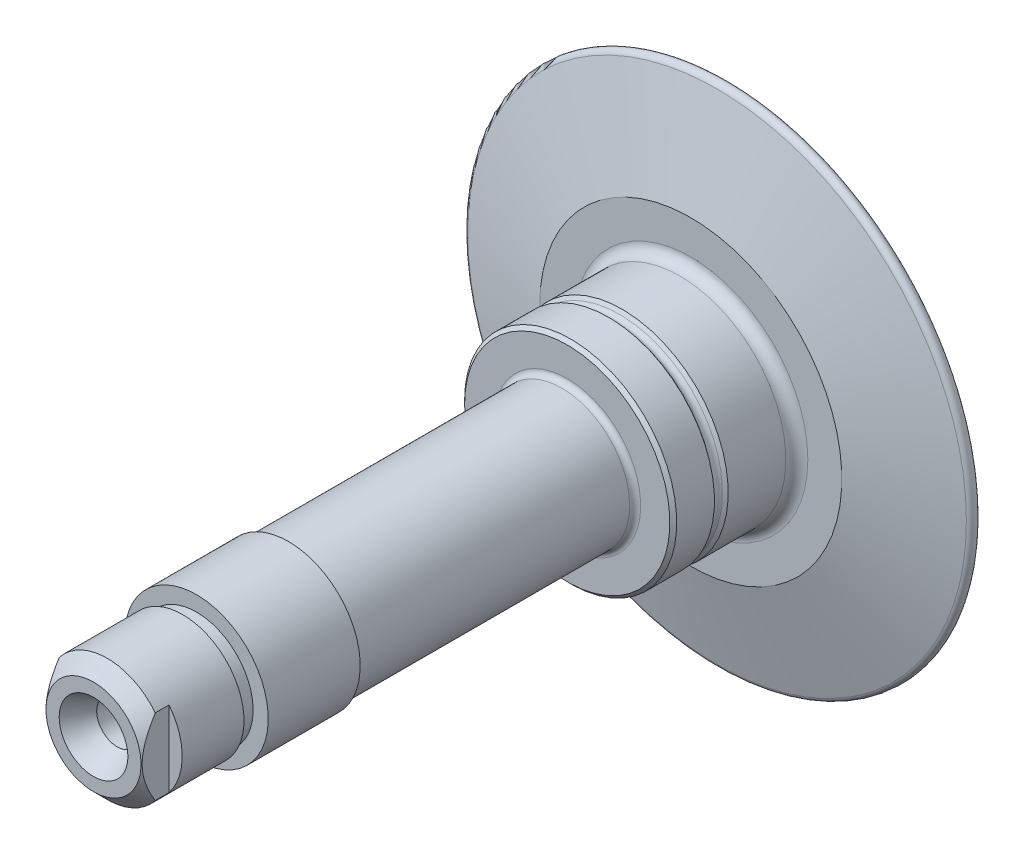
ISO-10303-21;
HEADER;
FILE_DESCRIPTION(('STEP AP214'),'2;1');
FILE_NAME('part.step','',(''),(''),'','','');
FILE_SCHEMA(('AUTOMOTIVE_DESIGN { 1 0 10303 214 1 1 1 1 }'));
ENDSEC;
DATA;
#1=APPLICATION_CONTEXT('core data for automotive mechanical design processes');
#2=APPLICATION_PROTOCOL_DEFINITION('international standard','automotive_design',2000,#1);
#3=PRODUCT_CONTEXT('',#1,'mechanical');
#4=PRODUCT('Part','Part','',(#3));
#5=PRODUCT_RELATED_PRODUCT_CATEGORY('part','',(#4));
#6=PRODUCT_DEFINITION_FORMATION('','',#4);
#7=PRODUCT_DEFINITION_CONTEXT('part definition',#1,'design');
#8=PRODUCT_DEFINITION('design','',#6,#7);
#9=PRODUCT_DEFINITION_SHAPE('','',#8);
#10=(LENGTH_UNIT() NAMED_UNIT(*) SI_UNIT(.MILLI.,.METRE.));
#11=(NAMED_UNIT(*) PLANE_ANGLE_UNIT() SI_UNIT($,.RADIAN.));
#12=(NAMED_UNIT(*) SI_UNIT($,.STERADIAN.) SOLID_ANGLE_UNIT());
#13=UNCERTAINTY_MEASURE_WITH_UNIT(LENGTH_MEASURE(1.E-05),#10,'distance_accuracy_value','');
#14=(GEOMETRIC_REPRESENTATION_CONTEXT(3) GLOBAL_UNCERTAINTY_ASSIGNED_CONTEXT((#13)) GLOBAL_UNIT_ASSIGNED_CONTEXT((#10,
#11,#12)) REPRESENTATION_CONTEXT('',''));
#15=CARTESIAN_POINT('',(0.,0.,0.));
#16=DIRECTION('',(0.,0.,1.));
#17=DIRECTION('',(1.,0.,0.));
#18=AXIS2_PLACEMENT_3D('',#15,#16,#17);
#19=CARTESIAN_POINT('',(0.,0.,60.));
#20=DIRECTION('',(0.,0.,-1.));
#21=DIRECTION('',(0.,1.,0.));
#22=AXIS2_PLACEMENT_3D('',#19,#20,#21);
#23=SPHERICAL_SURFACE('',#22,60.);
#24=CARTESIAN_POINT('',(0.,0.,2.81806583556102));
#25=DIRECTION('',(0.,0.,-1.));
#26=DIRECTION('',(-1.,0.,0.));
#27=AXIS2_PLACEMENT_3D('',#24,#25,#26);
#28=CIRCLE('',#27,18.1721326545281);
#29=CARTESIAN_POINT('',(-18.1721326545281,0.,2.81806583556102));
#30=VERTEX_POINT('',#29);
#31=EDGE_CURVE('E134',#30,#30,#28,.T.);
#32=ORIENTED_EDGE('',*,*,#31,.T.);
#33=EDGE_LOOP('',(#32));
#34=FACE_BOUND('',#33,.T.);
#35=ADVANCED_FACE('F43',(#34),#23,.T.);
#36=CARTESIAN_POINT('',(0.,0.,44.1692401209724));
#37=DIRECTION('',(0.,0.,1.));
#38=DIRECTION('',(1.,0.,0.));
#39=AXIS2_PLACEMENT_3D('',#36,#37,#38);
#40=CONICAL_SURFACE('',#39,1.49999999999999,1.02974425867665);
#41=CARTESIAN_POINT('',(0.,0.,43.2679491924311));
#42=VERTEX_POINT('',#41);
#43=VERTEX_LOOP('',#42);
#44=FACE_BOUND('',#43,.T.);
#45=CARTESIAN_POINT('',(0.,0.,44.1692401209724));
#46=DIRECTION('',(0.,0.,-1.));
#47=DIRECTION('',(-1.,0.,0.));
#48=AXIS2_PLACEMENT_3D('',#45,#46,#47);
#49=CIRCLE('',#48,1.49999999999999);
#50=CARTESIAN_POINT('',(-1.49999999999999,0.,44.1692401209724));
#51=VERTEX_POINT('',#50);
#52=EDGE_CURVE('E120',#51,#51,#49,.T.);
#53=ORIENTED_EDGE('',*,*,#52,.F.);
#54=EDGE_LOOP('',(#53));
#55=FACE_BOUND('',#54,.T.);
#56=ADVANCED_FACE('F174',(#44,#55),#40,.F.);
#57=CARTESIAN_POINT('',(0.,0.,0.));
#58=DIRECTION('',(0.,0.,-1.));
#59=DIRECTION('',(-1.,0.,0.));
#60=AXIS2_PLACEMENT_3D('',#57,#58,#59);
#61=CYLINDRICAL_SURFACE('',#60,1.49999999999999);
#62=ORIENTED_EDGE('',*,*,#52,.T.);
#63=EDGE_LOOP('',(#62));
#64=FACE_BOUND('',#63,.T.);
#65=CARTESIAN_POINT('',(0.,0.,47.2679491924311));
#66=DIRECTION('',(0.,0.,-1.));
#67=DIRECTION('',(-1.,0.,0.));
#68=AXIS2_PLACEMENT_3D('',#65,#66,#67);
#69=CIRCLE('',#68,1.49999999999999);
#70=CARTESIAN_POINT('',(-1.49999999999999,0.,47.2679491924311));
#71=VERTEX_POINT('',#70);
#72=EDGE_CURVE('E117',#71,#71,#69,.T.);
#73=ORIENTED_EDGE('',*,*,#72,.F.);
#74=EDGE_LOOP('',(#73));
#75=FACE_BOUND('',#74,.T.);
#76=ADVANCED_FACE('F179',(#64,#75),#61,.F.);
#77=CARTESIAN_POINT('',(0.,0.,49.));
#78=DIRECTION('',(0.,0.,1.));
#79=DIRECTION('',(1.,0.,0.));
#80=AXIS2_PLACEMENT_3D('',#77,#78,#79);
#81=CONICAL_SURFACE('',#80,2.49999999999999,0.523598775598293);
#82=ORIENTED_EDGE('',*,*,#72,.T.);
#83=EDGE_LOOP('',(#82));
#84=FACE_BOUND('',#83,.T.);
#85=CARTESIAN_POINT('',(0.,0.,49.));
#86=DIRECTION('',(0.,0.,-1.));
#87=DIRECTION('',(-1.,0.,0.));
#88=AXIS2_PLACEMENT_3D('',#85,#86,#87);
#89=CIRCLE('',#88,2.49999999999999);
#90=CARTESIAN_POINT('',(-2.49999999999999,0.,49.));
#91=VERTEX_POINT('',#90);
#92=EDGE_CURVE('E109',#91,#91,#89,.T.);
#93=ORIENTED_EDGE('',*,*,#92,.F.);
#94=EDGE_LOOP('',(#93));
#95=FACE_BOUND('',#94,.T.);
#96=ADVANCED_FACE('F487',(#84,#95),#81,.F.);
#97=CARTESIAN_POINT('',(0.,3.46000000000008,49.));
#98=DIRECTION('',(0.,0.,1.));
#99=DIRECTION('',(1.,0.,0.));
#100=AXIS2_PLACEMENT_3D('',#97,#98,#99);
#101=PLANE('',#100);
#102=ORIENTED_EDGE('',*,*,#92,.T.);
#103=EDGE_LOOP('',(#102));
#104=FACE_BOUND('',#103,.T.);
#105=CARTESIAN_POINT('',(0.,0.,49.));
#106=DIRECTION('',(0.,0.,-1.));
#107=DIRECTION('',(-1.,0.,0.));
#108=AXIS2_PLACEMENT_3D('',#105,#106,#107);
#109=CIRCLE('',#108,3.46000000000008);
#110=CARTESIAN_POINT('',(-3.46000000000008,0.,49.));
#111=VERTEX_POINT('',#110);
#112=EDGE_CURVE('E105',#111,#111,#109,.T.);
#113=ORIENTED_EDGE('',*,*,#112,.F.);
#114=EDGE_LOOP('',(#113));
#115=FACE_BOUND('',#114,.T.);
#116=ADVANCED_FACE('F155',(#104,#115),#101,.T.);
#117=CARTESIAN_POINT('',(0.,0.,48.));
#118=DIRECTION('',(0.,0.,-1.));
#119=DIRECTION('',(-1.,0.,0.));
#120=AXIS2_PLACEMENT_3D('',#117,#118,#119);
#121=CONICAL_SURFACE('',#120,4.45999999999999,0.785398163397405);
#122=CARTESIAN_POINT('',(-3.5,-7.11817970140146,44.5278828638598));
#123=CARTESIAN_POINT('',(-3.5,-6.95628515467729,44.6731443202349));
#124=CARTESIAN_POINT('',(-3.5,-6.79392843074706,44.817895155602));
#125=CARTESIAN_POINT('',(-3.5,-6.46804769240731,45.1061050222319));
#126=CARTESIAN_POINT('',(-3.5,-6.30452357688794,45.249563939105));
#127=CARTESIAN_POINT('',(-3.5,-5.97550848709255,45.5354020134382));
#128=CARTESIAN_POINT('',(-3.5,-5.81001258158247,45.6777755044755));
#129=CARTESIAN_POINT('',(-3.5,-5.47732060012213,45.960511866747));
#130=CARTESIAN_POINT('',(-3.5,-5.31012459164605,46.1008748172476));
#131=CARTESIAN_POINT('',(-3.5,-4.96401528403337,46.3869926431026));
#132=CARTESIAN_POINT('',(-3.5,-4.78497795819908,46.5325978964103));
#133=CARTESIAN_POINT('',(-3.5,-4.4239127397559,46.820048565151));
#134=CARTESIAN_POINT('',(-3.5,-4.24188500244293,46.9618941748336));
#135=CARTESIAN_POINT('',(-3.5,-3.874227504637,47.2403037071483));
#136=CARTESIAN_POINT('',(-3.5,-3.68860328374729,47.3768749120205));
#137=CARTESIAN_POINT('',(-3.5,-3.31237412103163,47.6429389977499));
#138=CARTESIAN_POINT('',(-3.5,-3.12177063352887,47.7724339119988));
#139=CARTESIAN_POINT('',(-3.5,-2.78391064511263,47.9892051380979));
#140=CARTESIAN_POINT('',(-3.5,-2.63812872404254,48.0787672096752));
#141=CARTESIAN_POINT('',(-3.5,-2.34208920727856,48.2503905386758));
#142=CARTESIAN_POINT('',(-3.5,-2.19182991712576,48.3324489072699));
#143=CARTESIAN_POINT('',(-3.5,-1.88742049450989,48.4856820043121));
#144=CARTESIAN_POINT('',(-3.5,-1.73331507780105,48.5569444696307));
#145=CARTESIAN_POINT('',(-3.5,-1.41948384948545,48.6858072626518));
#146=CARTESIAN_POINT('',(-3.5,-1.25976285884852,48.7434189957689));
#147=CARTESIAN_POINT('',(-3.5,-0.994724235595581,48.8227079130209));
#148=CARTESIAN_POINT('',(-3.5,-0.891029854615224,48.8498056017889));
#149=CARTESIAN_POINT('',(-3.5,-0.681800782154657,48.8956702880139));
#150=CARTESIAN_POINT('',(-3.5,-0.576266395068817,48.914438650063));
#151=CARTESIAN_POINT('',(-3.5,-0.364299855658049,48.9426536838431));
#152=CARTESIAN_POINT('',(-3.5,-0.257871879273694,48.9521312812515));
#153=CARTESIAN_POINT('',(-3.5,-0.0445885189874283,48.9613373163803));
#154=CARTESIAN_POINT('',(-3.5,0.0622668605898686,48.9610658524969));
#155=CARTESIAN_POINT('',(-3.5,0.275454924122703,48.9507920252998));
#156=CARTESIAN_POINT('',(-3.5,0.381787811808315,48.9407938176232));
#157=CARTESIAN_POINT('',(-3.5,0.593178062147929,48.9116352804396));
#158=CARTESIAN_POINT('',(-3.5,0.698235323269597,48.8924742264627));
#159=CARTESIAN_POINT('',(-3.5,0.906920387220526,48.8458459835073));
#160=CARTESIAN_POINT('',(-3.5,1.01054050130853,48.8183448413991));
#161=CARTESIAN_POINT('',(-3.5,1.21559128337704,48.7562033195798));
#162=CARTESIAN_POINT('',(-3.5,1.31702191103008,48.7215628084946));
#163=CARTESIAN_POINT('',(-3.5,1.5419060652411,48.6371569918555));
#164=CARTESIAN_POINT('',(-3.5,1.6647437491875,48.5857604893079));
#165=CARTESIAN_POINT('',(-3.5,1.90710174823051,48.475608570858));
#166=CARTESIAN_POINT('',(-3.5,2.02662036464063,48.4168494686116));
#167=CARTESIAN_POINT('',(-3.5,2.26283364668106,48.2934358174072));
#168=CARTESIAN_POINT('',(-3.5,2.37952264611784,48.2287705059261));
#169=CARTESIAN_POINT('',(-3.5,2.61020619640946,48.0948701530267));
#170=CARTESIAN_POINT('',(-3.5,2.72420116733442,48.0256358305082));
#171=CARTESIAN_POINT('',(-3.5,2.95148634966356,47.8825148974189));
#172=CARTESIAN_POINT('',(-3.5,3.0647436232809,47.8085762227774));
#173=CARTESIAN_POINT('',(-3.5,3.2892345085102,47.6576923394427));
#174=CARTESIAN_POINT('',(-3.5,3.40046805829291,47.5807470391156));
#175=CARTESIAN_POINT('',(-3.5,3.62107789113747,47.4245110324368));
#176=CARTESIAN_POINT('',(-3.5,3.73045616974801,47.3452231357746));
#177=CARTESIAN_POINT('',(-3.5,3.94773233663406,47.1846575804195));
#178=CARTESIAN_POINT('',(-3.5,4.05563028092794,47.1033799973456));
#179=CARTESIAN_POINT('',(-3.5,4.28998021082993,46.9240055503864));
#180=CARTESIAN_POINT('',(-3.5,4.41617699645939,46.8255756765214));
#181=CARTESIAN_POINT('',(-3.5,4.66708253968525,46.6268350475402));
#182=CARTESIAN_POINT('',(-3.5,4.79179125511928,46.5265242393364));
#183=CARTESIAN_POINT('',(-3.5,5.16407089570345,46.2232701040027));
#184=CARTESIAN_POINT('',(-3.5,5.40976766124745,46.0180264781648));
#185=CARTESIAN_POINT('',(-3.5,5.89763203848252,45.603203351602));
#186=CARTESIAN_POINT('',(-3.5,6.13979809954459,45.3936220381237));
#187=CARTESIAN_POINT('',(-3.5,6.62141661493497,44.9713581753736));
#188=CARTESIAN_POINT('',(-3.5,6.8608690052476,44.7586755532112));
#189=CARTESIAN_POINT('',(-3.5,7.33818597773268,44.3305581226463));
#190=CARTESIAN_POINT('',(-3.5,7.57604628122964,44.1151185533684));
#191=CARTESIAN_POINT('',(-3.5,8.05013816250165,43.6824505365551));
#192=CARTESIAN_POINT('',(-3.5,8.28636971815153,43.4652220648066));
#193=CARTESIAN_POINT('',(-3.5,8.99301415461073,42.8115791588059));
#194=CARTESIAN_POINT('',(-3.5,9.46150679772246,42.3730897955083));
#195=CARTESIAN_POINT('',(-3.5,10.3397584202392,41.5447746059041));
#196=CARTESIAN_POINT('',(-3.5,10.7498929229569,41.1553455760196));
#197=CARTESIAN_POINT('',(-3.5,11.5682885854657,40.3744593450757));
#198=CARTESIAN_POINT('',(-3.5,11.9765495931899,39.9830019846862));
#199=CARTESIAN_POINT('',(-3.5,12.7901987378166,39.2000241660108));
#200=CARTESIAN_POINT('',(-3.5,13.1955919271289,38.8085089524679));
#201=CARTESIAN_POINT('',(-3.5,14.0052466352267,38.0243833569202));
#202=CARTESIAN_POINT('',(-3.5,14.4095082535417,37.6317730777126));
#203=CARTESIAN_POINT('',(-3.5,14.8133767977005,37.2387604923028));
#204=B_SPLINE_CURVE_WITH_KNOTS('',3,(#122,#123,#124,#125,#126,#127,#128,#129,#130,#131,#132,
#133,#134,#135,#136,#137,#138,#139,#140,#141,#142,#143,#144,#145,#146,#147,#148,#149,#150,#151,
#152,#153,#154,#155,#156,#157,#158,#159,#160,#161,#162,#163,#164,#165,#166,#167,#168,#169,#170,
#171,#172,#173,#174,#175,#176,#177,#178,#179,#180,#181,#182,#183,#184,#185,#186,#187,#188,#189,
#190,#191,#192,#193,#194,#195,#196,#197,#198,#199,#200,#201,#202,#203),.UNSPECIFIED.,.F.,.F.,(4,
2,2,2,2,2,2,2,2,2,2,2,2,2,2,2,2,2,2,2,2,2,2,2,2,2,2,2,2,2,2,2,2,2,2,2,2,2,2,2,4),(0.,
0.65253430021402,1.30512582036193,1.96004191353779,2.61493211488628,3.30720793785708,
3.99944792298984,4.6906952379698,5.38174286517156,5.89486809102095,6.4081900390351,
6.91708621993759,7.42555569832354,7.74679870938486,8.06798907181619,8.38810663734153,
8.70822097195913,9.02819860152331,9.34820153463291,9.6695251223634,9.99085462341194,
10.3900075563802,10.7893611438972,11.1894575484486,11.5894911502139,11.9951995701978,
12.4009203647308,12.8061728574903,13.2114099722742,13.6915189365065,14.1716414718047,
15.1319914325598,16.0927511757587,17.0535335363618,18.0162919915634,18.9790634993696,
20.904080998024,22.6007734036482,24.2976011723876,25.9883532448592,27.6789516115328),.UNSPECIFIED.);
#205=CARTESIAN_POINT('',(-3.5,-2.76434440690735,48.));
#206=VERTEX_POINT('',#205);
#207=CARTESIAN_POINT('',(-3.5,2.76434440690735,48.));
#208=VERTEX_POINT('',#207);
#209=EDGE_CURVE('E93',#206,#208,#204,.T.);
#210=ORIENTED_EDGE('',*,*,#209,.F.);
#211=CARTESIAN_POINT('',(0.,0.,48.));
#212=DIRECTION('',(0.,0.,-1.));
#213=DIRECTION('',(-1.,0.,0.));
#214=AXIS2_PLACEMENT_3D('',#211,#212,#213);
#215=CIRCLE('',#214,4.45999999999999);
#216=CARTESIAN_POINT('',(3.5,-2.76434440690735,48.));
#217=VERTEX_POINT('',#216);
#218=EDGE_CURVE('E100',#217,#206,#215,.T.);
#219=ORIENTED_EDGE('',*,*,#218,.F.);
#220=CARTESIAN_POINT('',(3.5,-7.11817970140146,44.5278828638598));
#221=CARTESIAN_POINT('',(3.5,-6.95628515467729,44.6731443202349));
#222=CARTESIAN_POINT('',(3.5,-6.79392843074706,44.817895155602));
#223=CARTESIAN_POINT('',(3.5,-6.46804769240731,45.1061050222319));
#224=CARTESIAN_POINT('',(3.5,-6.30452357688794,45.249563939105));
#225=CARTESIAN_POINT('',(3.5,-5.97550848709255,45.5354020134382));
#226=CARTESIAN_POINT('',(3.5,-5.81001258158247,45.6777755044755));
#227=CARTESIAN_POINT('',(3.5,-5.47732060012213,45.960511866747));
#228=CARTESIAN_POINT('',(3.5,-5.31012459164605,46.1008748172476));
#229=CARTESIAN_POINT('',(3.5,-4.96401528403337,46.3869926431026));
#230=CARTESIAN_POINT('',(3.5,-4.78497795819908,46.5325978964103));
#231=CARTESIAN_POINT('',(3.5,-4.4239127397559,46.820048565151));
#232=CARTESIAN_POINT('',(3.5,-4.24188500244293,46.9618941748336));
#233=CARTESIAN_POINT('',(3.5,-3.874227504637,47.2403037071483));
#234=CARTESIAN_POINT('',(3.5,-3.68860328374729,47.3768749120205));
#235=CARTESIAN_POINT('',(3.5,-3.31237412103163,47.6429389977499));
#236=CARTESIAN_POINT('',(3.5,-3.12177063352887,47.7724339119988));
#237=CARTESIAN_POINT('',(3.5,-2.78391064511263,47.9892051380979));
#238=CARTESIAN_POINT('',(3.5,-2.63812872404254,48.0787672096752));
#239=CARTESIAN_POINT('',(3.5,-2.34208920727856,48.2503905386758));
#240=CARTESIAN_POINT('',(3.5,-2.19182991712576,48.3324489072699));
#241=CARTESIAN_POINT('',(3.5,-1.88742049450989,48.4856820043121));
#242=CARTESIAN_POINT('',(3.5,-1.73331507780105,48.5569444696307));
#243=CARTESIAN_POINT('',(3.5,-1.41948384948545,48.6858072626518));
#244=CARTESIAN_POINT('',(3.5,-1.25976285884852,48.7434189957689));
#245=CARTESIAN_POINT('',(3.5,-0.994724235595581,48.8227079130209));
#246=CARTESIAN_POINT('',(3.5,-0.891029854615224,48.8498056017889));
#247=CARTESIAN_POINT('',(3.5,-0.681800782154657,48.8956702880139));
#248=CARTESIAN_POINT('',(3.5,-0.576266395068817,48.914438650063));
#249=CARTESIAN_POINT('',(3.5,-0.364299855658049,48.9426536838431));
#250=CARTESIAN_POINT('',(3.5,-0.257871879273694,48.9521312812515));
#251=CARTESIAN_POINT('',(3.5,-0.0445885189874283,48.9613373163803));
#252=CARTESIAN_POINT('',(3.5,0.0622668605898686,48.9610658524969));
#253=CARTESIAN_POINT('',(3.5,0.275454924122703,48.9507920252998));
#254=CARTESIAN_POINT('',(3.5,0.381787811808315,48.9407938176232));
#255=CARTESIAN_POINT('',(3.5,0.593178062147929,48.9116352804396));
#256=CARTESIAN_POINT('',(3.5,0.698235323269597,48.8924742264627));
#257=CARTESIAN_POINT('',(3.5,0.906920387220526,48.8458459835073));
#258=CARTESIAN_POINT('',(3.5,1.01054050130853,48.8183448413991));
#259=CARTESIAN_POINT('',(3.5,1.21559128337704,48.7562033195798));
#260=CARTESIAN_POINT('',(3.5,1.31702191103008,48.7215628084946));
#261=CARTESIAN_POINT('',(3.5,1.5419060652411,48.6371569918555));
#262=CARTESIAN_POINT('',(3.5,1.6647437491875,48.5857604893079));
#263=CARTESIAN_POINT('',(3.5,1.90710174823051,48.475608570858));
#264=CARTESIAN_POINT('',(3.5,2.02662036464063,48.4168494686116));
#265=CARTESIAN_POINT('',(3.5,2.26283364668106,48.2934358174072));
#266=CARTESIAN_POINT('',(3.5,2.37952264611784,48.2287705059261));
#267=CARTESIAN_POINT('',(3.5,2.61020619640946,48.0948701530267));
#268=CARTESIAN_POINT('',(3.5,2.72420116733442,48.0256358305082));
#269=CARTESIAN_POINT('',(3.5,2.95148634966356,47.8825148974189));
#270=CARTESIAN_POINT('',(3.5,3.0647436232809,47.8085762227774));
#271=CARTESIAN_POINT('',(3.5,3.2892345085102,47.6576923394427));
#272=CARTESIAN_POINT('',(3.5,3.40046805829291,47.5807470391156));
#273=CARTESIAN_POINT('',(3.5,3.62107789113747,47.4245110324368));
#274=CARTESIAN_POINT('',(3.5,3.73045616974801,47.3452231357746));
#275=CARTESIAN_POINT('',(3.5,3.94773233663406,47.1846575804195));
#276=CARTESIAN_POINT('',(3.5,4.05563028092794,47.1033799973456));
#277=CARTESIAN_POINT('',(3.5,4.28998021082993,46.9240055503864));
#278=CARTESIAN_POINT('',(3.5,4.41617699645939,46.8255756765214));
#279=CARTESIAN_POINT('',(3.5,4.66708253968525,46.6268350475402));
#280=CARTESIAN_POINT('',(3.5,4.79179125511928,46.5265242393364));
#281=CARTESIAN_POINT('',(3.5,5.16407089570345,46.2232701040027));
#282=CARTESIAN_POINT('',(3.5,5.40976766124745,46.0180264781648));
#283=CARTESIAN_POINT('',(3.5,5.89763203848252,45.603203351602));
#284=CARTESIAN_POINT('',(3.5,6.13979809954459,45.3936220381237));
#285=CARTESIAN_POINT('',(3.5,6.62141661493497,44.9713581753736));
#286=CARTESIAN_POINT('',(3.5,6.8608690052476,44.7586755532112));
#287=CARTESIAN_POINT('',(3.5,7.33818597773268,44.3305581226463));
#288=CARTESIAN_POINT('',(3.5,7.57604628122964,44.1151185533684));
#289=CARTESIAN_POINT('',(3.5,8.05013816250165,43.6824505365551));
#290=CARTESIAN_POINT('',(3.5,8.28636971815153,43.4652220648066));
#291=CARTESIAN_POINT('',(3.5,8.99301415461073,42.8115791588059));
#292=CARTESIAN_POINT('',(3.5,9.46150679772246,42.3730897955083));
#293=CARTESIAN_POINT('',(3.5,10.3397584202392,41.5447746059041));
#294=CARTESIAN_POINT('',(3.5,10.7498929229569,41.1553455760196));
#295=CARTESIAN_POINT('',(3.5,11.5682885854657,40.3744593450757));
#296=CARTESIAN_POINT('',(3.5,11.9765495931899,39.9830019846862));
#297=CARTESIAN_POINT('',(3.5,12.7901987378166,39.2000241660108));
#298=CARTESIAN_POINT('',(3.5,13.1955919271289,38.8085089524679));
#299=CARTESIAN_POINT('',(3.5,14.0052466352267,38.0243833569202));
#300=CARTESIAN_POINT('',(3.5,14.4095082535417,37.6317730777126));
#301=CARTESIAN_POINT('',(3.5,14.8133767977005,37.2387604923028));
#302=B_SPLINE_CURVE_WITH_KNOTS('',3,(#220,#221,#222,#223,#224,#225,#226,#227,#228,#229,#230,
#231,#232,#233,#234,#235,#236,#237,#238,#239,#240,#241,#242,#243,#244,#245,#246,#247,#248,#249,
#250,#251,#252,#253,#254,#255,#256,#257,#258,#259,#260,#261,#262,#263,#264,#265,#266,#267,#268,
#269,#270,#271,#272,#273,#274,#275,#276,#277,#278,#279,#280,#281,#282,#283,#284,#285,#286,#287,
#288,#289,#290,#291,#292,#293,#294,#295,#296,#297,#298,#299,#300,#301),.UNSPECIFIED.,.F.,.F.,(4,
2,2,2,2,2,2,2,2,2,2,2,2,2,2,2,2,2,2,2,2,2,2,2,2,2,2,2,2,2,2,2,2,2,2,2,2,2,2,2,4),(0.,
0.65253430021402,1.30512582036193,1.96004191353779,2.61493211488628,3.30720793785708,
3.99944792298984,4.6906952379698,5.38174286517156,5.89486809102095,6.4081900390351,
6.91708621993759,7.42555569832354,7.74679870938486,8.06798907181619,8.38810663734153,
8.70822097195913,9.02819860152331,9.34820153463291,9.6695251223634,9.99085462341194,
10.3900075563802,10.7893611438972,11.1894575484486,11.5894911502139,11.9951995701978,
12.4009203647308,12.8061728574903,13.2114099722742,13.6915189365065,14.1716414718047,
15.1319914325598,16.0927511757587,17.0535335363618,18.0162919915634,18.9790634993696,
20.904080998024,22.6007734036482,24.2976011723876,25.9883532448592,27.6789516115328),.UNSPECIFIED.);
#303=CARTESIAN_POINT('',(3.5,2.76434440690735,48.));
#304=VERTEX_POINT('',#303);
#305=EDGE_CURVE('E130',#304,#217,#302,.F.);
#306=ORIENTED_EDGE('',*,*,#305,.F.);
#307=EDGE_CURVE('E106',#208,#304,#215,.T.);
#308=ORIENTED_EDGE('',*,*,#307,.F.);
#309=EDGE_LOOP('',(#210,#219,#306,#308));
#310=FACE_BOUND('',#309,.T.);
#311=ORIENTED_EDGE('',*,*,#112,.T.);
#312=EDGE_LOOP('',(#311));
#313=FACE_BOUND('',#312,.T.);
#314=ADVANCED_FACE('F132',(#310,#313),#121,.T.);
#315=CARTESIAN_POINT('',(0.,0.,0.));
#316=DIRECTION('',(0.,0.,-1.));
#317=DIRECTION('',(-1.,0.,0.));
#318=AXIS2_PLACEMENT_3D('',#315,#316,#317);
#319=CYLINDRICAL_SURFACE('',#318,4.45999999999999);
#320=DIRECTION('',(0.,0.,-1.));
#321=VECTOR('',#320,1.);
#322=CARTESIAN_POINT('',(-3.5,-2.76434440690735,0.));
#323=LINE('',#322,#321);
#324=CARTESIAN_POINT('',(-3.5,-2.76434440690735,47.));
#325=VERTEX_POINT('',#324);
#326=EDGE_CURVE('E11',#325,#206,#323,.F.);
#327=ORIENTED_EDGE('',*,*,#326,.F.);
#328=CARTESIAN_POINT('',(0.,0.,47.));
#329=DIRECTION('',(0.,0.,-1.));
#330=DIRECTION('',(-1.,0.,0.));
#331=AXIS2_PLACEMENT_3D('',#328,#329,#330);
#332=CIRCLE('',#331,4.45999999999999);
#333=CARTESIAN_POINT('',(-3.5,2.76434440690735,47.));
#334=VERTEX_POINT('',#333);
#335=EDGE_CURVE('E83',#334,#325,#332,.F.);
#336=ORIENTED_EDGE('',*,*,#335,.F.);
#337=DIRECTION('',(0.,0.,-1.));
#338=VECTOR('',#337,1.);
#339=CARTESIAN_POINT('',(-3.5,2.76434440690735,0.));
#340=LINE('',#339,#338);
#341=EDGE_CURVE('E50',#208,#334,#340,.T.);
#342=ORIENTED_EDGE('',*,*,#341,.F.);
#343=ORIENTED_EDGE('',*,*,#307,.T.);
#344=DIRECTION('',(0.,0.,-1.));
#345=VECTOR('',#344,1.);
#346=CARTESIAN_POINT('',(3.5,2.76434440690735,0.));
#347=LINE('',#346,#345);
#348=CARTESIAN_POINT('',(3.5,2.76434440690735,47.));
#349=VERTEX_POINT('',#348);
#350=EDGE_CURVE('E88',#349,#304,#347,.F.);
#351=ORIENTED_EDGE('',*,*,#350,.F.);
#352=CARTESIAN_POINT('',(0.,0.,47.));
#353=DIRECTION('',(0.,0.,1.));
#354=DIRECTION('',(1.,0.,0.));
#355=AXIS2_PLACEMENT_3D('',#352,#353,#354);
#356=CIRCLE('',#355,4.45999999999999);
#357=CARTESIAN_POINT('',(3.5,-2.76434440690735,47.));
#358=VERTEX_POINT('',#357);
#359=EDGE_CURVE('E123',#349,#358,#356,.F.);
#360=ORIENTED_EDGE('',*,*,#359,.T.);
#361=DIRECTION('',(0.,0.,-1.));
#362=VECTOR('',#361,1.);
#363=CARTESIAN_POINT('',(3.5,-2.76434440690735,0.));
#364=LINE('',#363,#362);
#365=EDGE_CURVE('E102',#217,#358,#364,.T.);
#366=ORIENTED_EDGE('',*,*,#365,.F.);
#367=ORIENTED_EDGE('',*,*,#218,.T.);
#368=EDGE_LOOP('',(#327,#336,#342,#343,#351,#360,#366,#367));
#369=FACE_BOUND('',#368,.T.);
#370=CARTESIAN_POINT('',(0.,0.,42.5));
#371=DIRECTION('',(0.,0.,-1.));
#372=DIRECTION('',(-1.,0.,0.));
#373=AXIS2_PLACEMENT_3D('',#370,#371,#372);
#374=CIRCLE('',#373,4.45999999999999);
#375=CARTESIAN_POINT('',(-4.45999999999999,0.,42.5));
#376=VERTEX_POINT('',#375);
#377=EDGE_CURVE('E111',#376,#376,#374,.T.);
#378=ORIENTED_EDGE('',*,*,#377,.F.);
#379=EDGE_LOOP('',(#378));
#380=FACE_BOUND('',#379,.T.);
#381=ADVANCED_FACE('F96',(#369,#380),#319,.T.);
#382=CARTESIAN_POINT('',(0.,4.45999999999999,42.5));
#383=DIRECTION('',(0.,0.,-1.));
#384=DIRECTION('',(-1.,0.,0.));
#385=AXIS2_PLACEMENT_3D('',#382,#383,#384);
#386=PLANE('',#385);
#387=ORIENTED_EDGE('',*,*,#377,.T.);
#388=EDGE_LOOP('',(#387));
#389=FACE_BOUND('',#388,.T.);
#390=CARTESIAN_POINT('',(0.,0.,42.5));
#391=DIRECTION('',(0.,0.,-1.));
#392=DIRECTION('',(-1.,0.,0.));
#393=AXIS2_PLACEMENT_3D('',#390,#391,#392);
#394=CIRCLE('',#393,4.12499999999999);
#395=CARTESIAN_POINT('',(-4.12499999999999,0.,42.5));
#396=VERTEX_POINT('',#395);
#397=EDGE_CURVE('E264',#396,#396,#394,.T.);
#398=ORIENTED_EDGE('',*,*,#397,.F.);
#399=EDGE_LOOP('',(#398));
#400=FACE_BOUND('',#399,.T.);
#401=ADVANCED_FACE('F251',(#389,#400),#386,.T.);
#402=CARTESIAN_POINT('',(0.,0.,0.));
#403=DIRECTION('',(0.,0.,-1.));
#404=DIRECTION('',(-1.,0.,0.));
#405=AXIS2_PLACEMENT_3D('',#402,#403,#404);
#406=CYLINDRICAL_SURFACE('',#405,4.12499999999999);
#407=ORIENTED_EDGE('',*,*,#397,.T.);
#408=EDGE_LOOP('',(#407));
#409=FACE_BOUND('',#408,.T.);
#410=CARTESIAN_POINT('',(0.,0.,41.5));
#411=DIRECTION('',(0.,0.,-1.));
#412=DIRECTION('',(-1.,0.,0.));
#413=AXIS2_PLACEMENT_3D('',#410,#411,#412);
#414=CIRCLE('',#413,4.12499999999999);
#415=CARTESIAN_POINT('',(-4.12499999999999,0.,41.5));
#416=VERTEX_POINT('',#415);
#417=EDGE_CURVE('E265',#416,#416,#414,.T.);
#418=ORIENTED_EDGE('',*,*,#417,.F.);
#419=EDGE_LOOP('',(#418));
#420=FACE_BOUND('',#419,.T.);
#421=ADVANCED_FACE('F248',(#409,#420),#406,.T.);
#422=CARTESIAN_POINT('',(0.,5.22499999999999,41.5));
#423=DIRECTION('',(0.,0.,1.));
#424=DIRECTION('',(1.,0.,0.));
#425=AXIS2_PLACEMENT_3D('',#422,#423,#424);
#426=PLANE('',#425);
#427=ORIENTED_EDGE('',*,*,#417,.T.);
#428=EDGE_LOOP('',(#427));
#429=FACE_BOUND('',#428,.T.);
#430=CARTESIAN_POINT('',(0.,0.,41.5));
#431=DIRECTION('',(0.,0.,-1.));
#432=DIRECTION('',(-1.,0.,0.));
#433=AXIS2_PLACEMENT_3D('',#430,#431,#432);
#434=CIRCLE('',#433,5.22499999999999);
#435=CARTESIAN_POINT('',(-5.22499999999999,0.,41.5));
#436=VERTEX_POINT('',#435);
#437=EDGE_CURVE('E267',#436,#436,#434,.T.);
#438=ORIENTED_EDGE('',*,*,#437,.F.);
#439=EDGE_LOOP('',(#438));
#440=FACE_BOUND('',#439,.T.);
#441=ADVANCED_FACE('F244',(#429,#440),#426,.T.);
#442=CARTESIAN_POINT('',(0.,0.,0.));
#443=DIRECTION('',(0.,0.,-1.));
#444=DIRECTION('',(-1.,0.,0.));
#445=AXIS2_PLACEMENT_3D('',#442,#443,#444);
#446=CYLINDRICAL_SURFACE('',#445,5.225);
#447=ORIENTED_EDGE('',*,*,#437,.T.);
#448=EDGE_LOOP('',(#447));
#449=FACE_BOUND('',#448,.T.);
#450=CARTESIAN_POINT('',(0.,0.,34.8));
#451=DIRECTION('',(0.,0.,-1.));
#452=DIRECTION('',(-1.,0.,0.));
#453=AXIS2_PLACEMENT_3D('',#450,#451,#452);
#454=CIRCLE('',#453,5.225);
#455=CARTESIAN_POINT('',(-5.225,0.,34.8));
#456=VERTEX_POINT('',#455);
#457=EDGE_CURVE('E272',#456,#456,#454,.T.);
#458=ORIENTED_EDGE('',*,*,#457,.F.);
#459=EDGE_LOOP('',(#458));
#460=FACE_BOUND('',#459,.T.);
#461=ADVANCED_FACE('F240',(#449,#460),#446,.T.);
#462=CARTESIAN_POINT('',(0.,4.95,34.8));
#463=DIRECTION('',(0.,0.,-1.));
#464=DIRECTION('',(-1.,0.,0.));
#465=AXIS2_PLACEMENT_3D('',#462,#463,#464);
#466=PLANE('',#465);
#467=ORIENTED_EDGE('',*,*,#457,.T.);
#468=EDGE_LOOP('',(#467));
#469=FACE_BOUND('',#468,.T.);
#470=CARTESIAN_POINT('',(0.,0.,34.8));
#471=DIRECTION('',(0.,0.,-1.));
#472=DIRECTION('',(-1.,0.,0.));
#473=AXIS2_PLACEMENT_3D('',#470,#471,#472);
#474=CIRCLE('',#473,4.95);
#475=CARTESIAN_POINT('',(-4.95,0.,34.8));
#476=VERTEX_POINT('',#475);
#477=EDGE_CURVE('E275',#476,#476,#474,.T.);
#478=ORIENTED_EDGE('',*,*,#477,.F.);
#479=EDGE_LOOP('',(#478));
#480=FACE_BOUND('',#479,.T.);
#481=ADVANCED_FACE('F236',(#469,#480),#466,.T.);
#482=CARTESIAN_POINT('',(0.,0.,0.));
#483=DIRECTION('',(0.,0.,-1.));
#484=DIRECTION('',(-1.,0.,0.));
#485=AXIS2_PLACEMENT_3D('',#482,#483,#484);
#486=CYLINDRICAL_SURFACE('',#485,4.95);
#487=ORIENTED_EDGE('',*,*,#477,.T.);
#488=EDGE_LOOP('',(#487));
#489=FACE_BOUND('',#488,.T.);
#490=CARTESIAN_POINT('',(0.,0.,14.9));
#491=DIRECTION('',(0.,0.,-1.));
#492=DIRECTION('',(-1.,0.,0.));
#493=AXIS2_PLACEMENT_3D('',#490,#491,#492);
#494=CIRCLE('',#493,4.95);
#495=CARTESIAN_POINT('',(-4.95,0.,14.9));
#496=VERTEX_POINT('',#495);
#497=EDGE_CURVE('E278',#496,#496,#494,.T.);
#498=ORIENTED_EDGE('',*,*,#497,.F.);
#499=EDGE_LOOP('',(#498));
#500=FACE_BOUND('',#499,.T.);
#501=ADVANCED_FACE('F232',(#489,#500),#486,.T.);
#502=CARTESIAN_POINT('',(0.,0.,14.9));
#503=DIRECTION('',(0.,0.,-1.));
#504=DIRECTION('',(-1.,0.,0.));
#505=AXIS2_PLACEMENT_3D('',#502,#503,#504);
#506=TOROIDAL_SURFACE('',#505,5.35,0.4);
#507=ORIENTED_EDGE('',*,*,#497,.T.);
#508=EDGE_LOOP('',(#507));
#509=FACE_BOUND('',#508,.T.);
#510=CARTESIAN_POINT('',(0.,0.,14.5));
#511=DIRECTION('',(0.,0.,-1.));
#512=DIRECTION('',(-1.,0.,0.));
#513=AXIS2_PLACEMENT_3D('',#510,#511,#512);
#514=CIRCLE('',#513,5.35);
#515=CARTESIAN_POINT('',(-5.35,0.,14.5));
#516=VERTEX_POINT('',#515);
#517=EDGE_CURVE('E281',#516,#516,#514,.T.);
#518=ORIENTED_EDGE('',*,*,#517,.F.);
#519=EDGE_LOOP('',(#518));
#520=FACE_BOUND('',#519,.T.);
#521=ADVANCED_FACE('F228',(#509,#520),#506,.F.);
#522=CARTESIAN_POINT('',(0.,7.47500000000002,14.5));
#523=DIRECTION('',(0.,0.,1.));
#524=DIRECTION('',(1.,0.,0.));
#525=AXIS2_PLACEMENT_3D('',#522,#523,#524);
#526=PLANE('',#525);
#527=ORIENTED_EDGE('',*,*,#517,.T.);
#528=EDGE_LOOP('',(#527));
#529=FACE_BOUND('',#528,.T.);
#530=CARTESIAN_POINT('',(0.,0.,14.5));
#531=DIRECTION('',(0.,0.,-1.));
#532=DIRECTION('',(-1.,0.,0.));
#533=AXIS2_PLACEMENT_3D('',#530,#531,#532);
#534=CIRCLE('',#533,7.47500000000002);
#535=CARTESIAN_POINT('',(-7.47500000000002,0.,14.5));
#536=VERTEX_POINT('',#535);
#537=EDGE_CURVE('E284',#536,#536,#534,.T.);
#538=ORIENTED_EDGE('',*,*,#537,.F.);
#539=EDGE_LOOP('',(#538));
#540=FACE_BOUND('',#539,.T.);
#541=ADVANCED_FACE('F224',(#529,#540),#526,.T.);
#542=CARTESIAN_POINT('',(0.,0.,14.25));
#543=DIRECTION('',(0.,0.,-1.));
#544=DIRECTION('',(-1.,0.,0.));
#545=AXIS2_PLACEMENT_3D('',#542,#543,#544);
#546=CONICAL_SURFACE('',#545,7.725,0.785398163397405);
#547=ORIENTED_EDGE('',*,*,#537,.T.);
#548=EDGE_LOOP('',(#547));
#549=FACE_BOUND('',#548,.T.);
#550=CARTESIAN_POINT('',(0.,0.,14.25));
#551=DIRECTION('',(0.,0.,-1.));
#552=DIRECTION('',(-1.,0.,0.));
#553=AXIS2_PLACEMENT_3D('',#550,#551,#552);
#554=CIRCLE('',#553,7.725);
#555=CARTESIAN_POINT('',(-7.725,0.,14.25));
#556=VERTEX_POINT('',#555);
#557=EDGE_CURVE('E287',#556,#556,#554,.T.);
#558=ORIENTED_EDGE('',*,*,#557,.F.);
#559=EDGE_LOOP('',(#558));
#560=FACE_BOUND('',#559,.T.);
#561=ADVANCED_FACE('F220',(#549,#560),#546,.T.);
#562=CARTESIAN_POINT('',(0.,0.,0.));
#563=DIRECTION('',(0.,0.,-1.));
#564=DIRECTION('',(-1.,0.,0.));
#565=AXIS2_PLACEMENT_3D('',#562,#563,#564);
#566=CYLINDRICAL_SURFACE('',#565,7.725);
#567=ORIENTED_EDGE('',*,*,#557,.T.);
#568=EDGE_LOOP('',(#567));
#569=FACE_BOUND('',#568,.T.);
#570=CARTESIAN_POINT('',(0.,0.,11.5));
#571=DIRECTION('',(0.,0.,-1.));
#572=DIRECTION('',(-1.,0.,0.));
#573=AXIS2_PLACEMENT_3D('',#570,#571,#572);
#574=CIRCLE('',#573,7.725);
#575=CARTESIAN_POINT('',(-7.725,0.,11.5));
#576=VERTEX_POINT('',#575);
#577=EDGE_CURVE('E290',#576,#576,#574,.T.);
#578=ORIENTED_EDGE('',*,*,#577,.F.);
#579=EDGE_LOOP('',(#578));
#580=FACE_BOUND('',#579,.T.);
#581=ADVANCED_FACE('F216',(#569,#580),#566,.T.);
#582=CARTESIAN_POINT('',(0.,0.,11.3173413361165));
#583=DIRECTION('',(0.,0.,1.));
#584=DIRECTION('',(1.,0.,0.));
#585=AXIS2_PLACEMENT_3D('',#582,#583,#584);
#586=CONICAL_SURFACE('',#585,7.48695459465774,0.916297857297021);
#587=ORIENTED_EDGE('',*,*,#577,.T.);
#588=EDGE_LOOP('',(#587));
#589=FACE_BOUND('',#588,.T.);
#590=CARTESIAN_POINT('',(0.,0.,11.3173413361165));
#591=DIRECTION('',(0.,0.,-1.));
#592=DIRECTION('',(-1.,0.,0.));
#593=AXIS2_PLACEMENT_3D('',#590,#591,#592);
#594=CIRCLE('',#593,7.48695459465774);
#595=CARTESIAN_POINT('',(-7.48695459465774,0.,11.3173413361165));
#596=VERTEX_POINT('',#595);
#597=EDGE_CURVE('E293',#596,#596,#594,.T.);
#598=ORIENTED_EDGE('',*,*,#597,.F.);
#599=EDGE_LOOP('',(#598));
#600=FACE_BOUND('',#599,.T.);
#601=ADVANCED_FACE('F212',(#589,#600),#586,.T.);
#602=CARTESIAN_POINT('',(0.,0.,11.));
#603=DIRECTION('',(0.,0.,-1.));
#604=DIRECTION('',(-1.,0.,0.));
#605=AXIS2_PLACEMENT_3D('',#602,#603,#604);
#606=TOROIDAL_SURFACE('',#605,7.73045916626123,0.399999999999999);
#607=ORIENTED_EDGE('',*,*,#597,.T.);
#608=EDGE_LOOP('',(#607));
#609=FACE_BOUND('',#608,.T.);
#610=CARTESIAN_POINT('',(0.,0.,10.6826586638835));
#611=DIRECTION('',(0.,0.,-1.));
#612=DIRECTION('',(-1.,0.,0.));
#613=AXIS2_PLACEMENT_3D('',#610,#611,#612);
#614=CIRCLE('',#613,7.48695459465774);
#615=CARTESIAN_POINT('',(-7.48695459465774,0.,10.6826586638835));
#616=VERTEX_POINT('',#615);
#617=EDGE_CURVE('E296',#616,#616,#614,.T.);
#618=ORIENTED_EDGE('',*,*,#617,.F.);
#619=EDGE_LOOP('',(#618));
#620=FACE_BOUND('',#619,.T.);
#621=ADVANCED_FACE('F208',(#609,#620),#606,.F.);
#622=CARTESIAN_POINT('',(0.,0.,10.5));
#623=DIRECTION('',(0.,0.,-1.));
#624=DIRECTION('',(-1.,0.,0.));
#625=AXIS2_PLACEMENT_3D('',#622,#623,#624);
#626=CONICAL_SURFACE('',#625,7.725,0.916297857297018);
#627=ORIENTED_EDGE('',*,*,#617,.T.);
#628=EDGE_LOOP('',(#627));
#629=FACE_BOUND('',#628,.T.);
#630=CARTESIAN_POINT('',(0.,0.,10.5));
#631=DIRECTION('',(0.,0.,-1.));
#632=DIRECTION('',(-1.,0.,0.));
#633=AXIS2_PLACEMENT_3D('',#630,#631,#632);
#634=CIRCLE('',#633,7.725);
#635=CARTESIAN_POINT('',(-7.725,0.,10.5));
#636=VERTEX_POINT('',#635);
#637=EDGE_CURVE('E299',#636,#636,#634,.T.);
#638=ORIENTED_EDGE('',*,*,#637,.F.);
#639=EDGE_LOOP('',(#638));
#640=FACE_BOUND('',#639,.T.);
#641=ADVANCED_FACE('F204',(#629,#640),#626,.T.);
#642=CARTESIAN_POINT('',(0.,0.,0.));
#643=DIRECTION('',(0.,0.,-1.));
#644=DIRECTION('',(-1.,0.,0.));
#645=AXIS2_PLACEMENT_3D('',#642,#643,#644);
#646=CYLINDRICAL_SURFACE('',#645,7.725);
#647=ORIENTED_EDGE('',*,*,#637,.T.);
#648=EDGE_LOOP('',(#647));
#649=FACE_BOUND('',#648,.T.);
#650=CARTESIAN_POINT('',(0.,0.,6.30000000000001));
#651=DIRECTION('',(0.,0.,-1.));
#652=DIRECTION('',(-1.,0.,0.));
#653=AXIS2_PLACEMENT_3D('',#650,#651,#652);
#654=CIRCLE('',#653,7.725);
#655=CARTESIAN_POINT('',(-7.725,0.,6.30000000000001));
#656=VERTEX_POINT('',#655);
#657=EDGE_CURVE('E302',#656,#656,#654,.T.);
#658=ORIENTED_EDGE('',*,*,#657,.F.);
#659=EDGE_LOOP('',(#658));
#660=FACE_BOUND('',#659,.T.);
#661=ADVANCED_FACE('F200',(#649,#660),#646,.T.);
#662=CARTESIAN_POINT('',(0.,0.,6.30000000000001));
#663=DIRECTION('',(0.,0.,-1.));
#664=DIRECTION('',(-1.,0.,0.));
#665=AXIS2_PLACEMENT_3D('',#662,#663,#664);
#666=TOROIDAL_SURFACE('',#665,8.525,0.8);
#667=ORIENTED_EDGE('',*,*,#657,.T.);
#668=EDGE_LOOP('',(#667));
#669=FACE_BOUND('',#668,.T.);
#670=CARTESIAN_POINT('',(0.,0.,5.50000000000001));
#671=DIRECTION('',(0.,0.,-1.));
#672=DIRECTION('',(-1.,0.,0.));
#673=AXIS2_PLACEMENT_3D('',#670,#671,#672);
#674=CIRCLE('',#673,8.525);
#675=CARTESIAN_POINT('',(-8.525,0.,5.50000000000001));
#676=VERTEX_POINT('',#675);
#677=EDGE_CURVE('E305',#676,#676,#674,.T.);
#678=ORIENTED_EDGE('',*,*,#677,.F.);
#679=EDGE_LOOP('',(#678));
#680=FACE_BOUND('',#679,.T.);
#681=ADVANCED_FACE('F196',(#669,#680),#666,.F.);
#682=CARTESIAN_POINT('',(0.,8.525,5.50000000000001));
#683=DIRECTION('',(0.,0.,1.));
#684=DIRECTION('',(1.,0.,0.));
#685=AXIS2_PLACEMENT_3D('',#682,#683,#684);
#686=PLANE('',#685);
#687=ORIENTED_EDGE('',*,*,#677,.T.);
#688=EDGE_LOOP('',(#687));
#689=FACE_BOUND('',#688,.T.);
#690=CARTESIAN_POINT('',(0.,0.,5.50000000000001));
#691=DIRECTION('',(0.,0.,-1.));
#692=DIRECTION('',(-1.,0.,0.));
#693=AXIS2_PLACEMENT_3D('',#690,#691,#692);
#694=CIRCLE('',#693,11.);
#695=CARTESIAN_POINT('',(-11.,0.,5.50000000000001));
#696=VERTEX_POINT('',#695);
#697=EDGE_CURVE('E308',#696,#696,#694,.T.);
#698=ORIENTED_EDGE('',*,*,#697,.F.);
#699=EDGE_LOOP('',(#698));
#700=FACE_BOUND('',#699,.T.);
#701=ADVANCED_FACE('F189',(#689,#700),#686,.T.);
#702=CARTESIAN_POINT('',(0.,0.,3.58293741525224));
#703=DIRECTION('',(0.,0.,-1.));
#704=DIRECTION('',(-1.,0.,0.));
#705=AXIS2_PLACEMENT_3D('',#702,#703,#704);
#706=CONICAL_SURFACE('',#705,18.1545749675679,1.30899693899574);
#707=ORIENTED_EDGE('',*,*,#697,.T.);
#708=EDGE_LOOP('',(#707));
#709=FACE_BOUND('',#708,.T.);
#710=CARTESIAN_POINT('',(0.,0.,3.58293741525224));
#711=DIRECTION('',(0.,0.,-1.));
#712=DIRECTION('',(-1.,0.,0.));
#713=AXIS2_PLACEMENT_3D('',#710,#711,#712);
#714=CIRCLE('',#713,18.1545749675679);
#715=CARTESIAN_POINT('',(-18.1545749675679,0.,3.58293741525224));
#716=VERTEX_POINT('',#715);
#717=EDGE_CURVE('E137',#716,#716,#714,.T.);
#718=ORIENTED_EDGE('',*,*,#717,.F.);
#719=EDGE_LOOP('',(#718));
#720=FACE_BOUND('',#719,.T.);
#721=ADVANCED_FACE('F184',(#709,#720),#706,.T.);
#722=CARTESIAN_POINT('',(0.,0.,3.19793201721427));
#723=DIRECTION('',(0.,0.,-1.));
#724=DIRECTION('',(-1.,0.,0.));
#725=AXIS2_PLACEMENT_3D('',#722,#723,#724);
#726=TOROIDAL_SURFACE('',#725,18.051413082082,0.398586917918019);
#727=ORIENTED_EDGE('',*,*,#717,.T.);
#728=EDGE_LOOP('',(#727));
#729=FACE_BOUND('',#728,.T.);
#730=ORIENTED_EDGE('',*,*,#31,.F.);
#731=EDGE_LOOP('',(#730));
#732=FACE_BOUND('',#731,.T.);
#733=ADVANCED_FACE('F172',(#729,#732),#726,.T.);
#734=CARTESIAN_POINT('',(3.5,6.11912449277339,47.));
#735=DIRECTION('',(-1.,0.,0.));
#736=DIRECTION('',(0.,0.,1.));
#737=AXIS2_PLACEMENT_3D('',#734,#735,#736);
#738=PLANE('',#737);
#739=ORIENTED_EDGE('',*,*,#350,.T.);
#740=ORIENTED_EDGE('',*,*,#305,.T.);
#741=ORIENTED_EDGE('',*,*,#365,.T.);
#742=DIRECTION('',(0.,-1.,0.));
#743=VECTOR('',#742,1.);
#744=CARTESIAN_POINT('',(3.5,6.11912449277339,47.));
#745=LINE('',#744,#743);
#746=EDGE_CURVE('E63',#349,#358,#745,.T.);
#747=ORIENTED_EDGE('',*,*,#746,.F.);
#748=EDGE_LOOP('',(#739,#740,#741,#747));
#749=FACE_BOUND('',#748,.T.);
#750=ADVANCED_FACE('F129',(#749),#738,.F.);
#751=CARTESIAN_POINT('',(3.5,-6.11912449277339,47.));
#752=DIRECTION('',(0.,0.,1.));
#753=DIRECTION('',(1.,0.,0.));
#754=AXIS2_PLACEMENT_3D('',#751,#752,#753);
#755=PLANE('',#754);
#756=ORIENTED_EDGE('',*,*,#746,.T.);
#757=ORIENTED_EDGE('',*,*,#359,.F.);
#758=EDGE_LOOP('',(#756,#757));
#759=FACE_BOUND('',#758,.T.);
#760=ADVANCED_FACE('F167',(#759),#755,.T.);
#761=CARTESIAN_POINT('',(-3.5,6.11912449277339,47.));
#762=DIRECTION('',(1.,0.,0.));
#763=DIRECTION('',(0.,0.,-1.));
#764=AXIS2_PLACEMENT_3D('',#761,#762,#763);
#765=PLANE('',#764);
#766=ORIENTED_EDGE('',*,*,#326,.T.);
#767=ORIENTED_EDGE('',*,*,#209,.T.);
#768=ORIENTED_EDGE('',*,*,#341,.T.);
#769=DIRECTION('',(0.,1.,0.));
#770=VECTOR('',#769,1.);
#771=CARTESIAN_POINT('',(-3.5,6.11912449277339,47.));
#772=LINE('',#771,#770);
#773=EDGE_CURVE('E56',#325,#334,#772,.T.);
#774=ORIENTED_EDGE('',*,*,#773,.F.);
#775=EDGE_LOOP('',(#766,#767,#768,#774));
#776=FACE_BOUND('',#775,.T.);
#777=ADVANCED_FACE('F91',(#776),#765,.F.);
#778=CARTESIAN_POINT('',(-3.5,-6.11912449277339,47.));
#779=DIRECTION('',(0.,0.,-1.));
#780=DIRECTION('',(-1.,0.,0.));
#781=AXIS2_PLACEMENT_3D('',#778,#779,#780);
#782=PLANE('',#781);
#783=ORIENTED_EDGE('',*,*,#335,.T.);
#784=ORIENTED_EDGE('',*,*,#773,.T.);
#785=EDGE_LOOP('',(#783,#784));
#786=FACE_BOUND('',#785,.T.);
#787=ADVANCED_FACE('F84',(#786),#782,.F.);
#788=CLOSED_SHELL('',(#35,#56,#76,#96,#116,#314,#381,#401,#421,#441,#461,#481,#501,#521,#541,
#561,#581,#601,#621,#641,#661,#681,#701,#721,#733,#750,#760,#777,#787));
#789=MANIFOLD_SOLID_BREP('B2',#788);
#790=ADVANCED_BREP_SHAPE_REPRESENTATION('',(#18,#789),#14);
#791=SHAPE_DEFINITION_REPRESENTATION(#9,#790);
ENDSEC;
END-ISO-10303-21;
